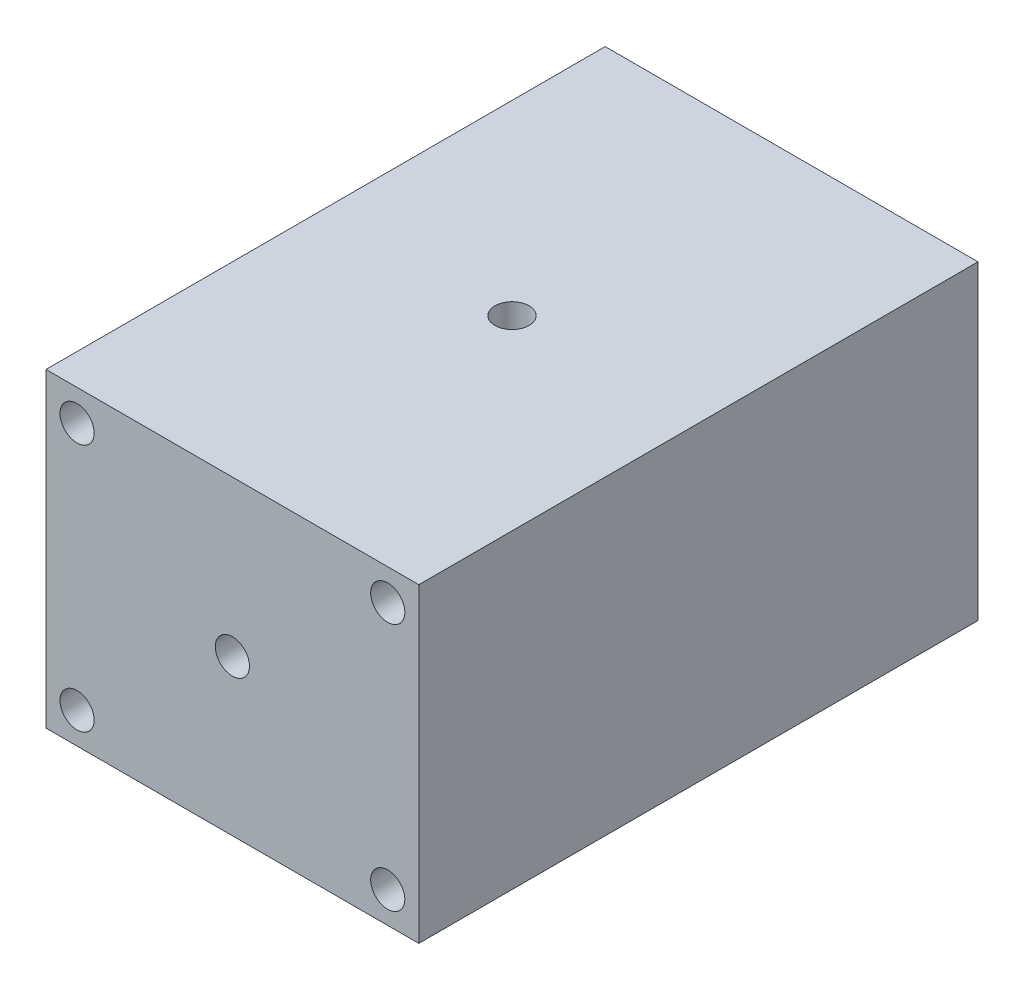
ISO-10303-21;
HEADER;
FILE_DESCRIPTION(('STEP AP214'),'2;1');
FILE_NAME('part.step','',(''),(''),'','','');
FILE_SCHEMA(('AUTOMOTIVE_DESIGN { 1 0 10303 214 1 1 1 1 }'));
ENDSEC;
DATA;
#1=APPLICATION_CONTEXT('core data for automotive mechanical design processes');
#2=APPLICATION_PROTOCOL_DEFINITION('international standard','automotive_design',2000,#1);
#3=PRODUCT_CONTEXT('',#1,'mechanical');
#4=PRODUCT('Part','Part','',(#3));
#5=PRODUCT_RELATED_PRODUCT_CATEGORY('part','',(#4));
#6=PRODUCT_DEFINITION_FORMATION('','',#4);
#7=PRODUCT_DEFINITION_CONTEXT('part definition',#1,'design');
#8=PRODUCT_DEFINITION('design','',#6,#7);
#9=PRODUCT_DEFINITION_SHAPE('','',#8);
#10=(LENGTH_UNIT() NAMED_UNIT(*) SI_UNIT(.MILLI.,.METRE.));
#11=(NAMED_UNIT(*) PLANE_ANGLE_UNIT() SI_UNIT($,.RADIAN.));
#12=(NAMED_UNIT(*) SI_UNIT($,.STERADIAN.) SOLID_ANGLE_UNIT());
#13=UNCERTAINTY_MEASURE_WITH_UNIT(LENGTH_MEASURE(1.E-05),#10,'distance_accuracy_value','');
#14=(GEOMETRIC_REPRESENTATION_CONTEXT(3) GLOBAL_UNCERTAINTY_ASSIGNED_CONTEXT((#13)) GLOBAL_UNIT_ASSIGNED_CONTEXT((#10,
#11,#12)) REPRESENTATION_CONTEXT('',''));
#15=CARTESIAN_POINT('',(0.,0.,0.));
#16=DIRECTION('',(0.,0.,1.));
#17=DIRECTION('',(1.,0.,0.));
#18=AXIS2_PLACEMENT_3D('',#15,#16,#17);
#19=CARTESIAN_POINT('',(0.,0.,90.));
#20=DIRECTION('',(0.,-1.,0.));
#21=DIRECTION('',(1.,0.,0.));
#22=AXIS2_PLACEMENT_3D('',#19,#20,#21);
#23=CYLINDRICAL_SURFACE('',#22,5.5);
#24=CARTESIAN_POINT('',(0.,0.,90.));
#25=DIRECTION('',(0.,-0.707106781186548,-0.707106781186548));
#26=DIRECTION('',(0.,0.707106781186548,-0.707106781186548));
#27=AXIS2_PLACEMENT_3D('',#24,#25,#26);
#28=ELLIPSE('',#27,7.778174593052,5.5);
#29=CARTESIAN_POINT('',(0.,5.5,84.5));
#30=VERTEX_POINT('',#29);
#31=CARTESIAN_POINT('',(5.5,0.,90.));
#32=VERTEX_POINT('',#31);
#33=EDGE_CURVE('E182',#30,#32,#28,.T.);
#34=ORIENTED_EDGE('',*,*,#33,.T.);
#35=DIRECTION('',(0.,1.,0.));
#36=VECTOR('',#35,1.);
#37=CARTESIAN_POINT('',(5.5,0.,90.));
#38=LINE('',#37,#36);
#39=CARTESIAN_POINT('',(5.5,50.,90.));
#40=VERTEX_POINT('',#39);
#41=EDGE_CURVE('E10',#32,#40,#38,.T.);
#42=ORIENTED_EDGE('',*,*,#41,.T.);
#43=CARTESIAN_POINT('',(0.,50.,90.));
#44=DIRECTION('',(0.,-1.,0.));
#45=DIRECTION('',(1.,0.,0.));
#46=AXIS2_PLACEMENT_3D('',#43,#44,#45);
#47=CIRCLE('',#46,5.5);
#48=EDGE_CURVE('E254',#40,#40,#47,.T.);
#49=ORIENTED_EDGE('',*,*,#48,.F.);
#50=ORIENTED_EDGE('',*,*,#41,.F.);
#51=CARTESIAN_POINT('',(0.,0.,90.));
#52=DIRECTION('',(0.,0.707106781186548,-0.707106781186548));
#53=DIRECTION('',(0.,-0.707106781186548,-0.707106781186548));
#54=AXIS2_PLACEMENT_3D('',#51,#52,#53);
#55=ELLIPSE('',#54,7.778174593052,5.5);
#56=CARTESIAN_POINT('',(-5.5,0.,90.));
#57=VERTEX_POINT('',#56);
#58=EDGE_CURVE('E271',#57,#32,#55,.T.);
#59=ORIENTED_EDGE('',*,*,#58,.F.);
#60=CARTESIAN_POINT('',(0.,0.,90.));
#61=DIRECTION('',(0.,-0.707106781186548,-0.707106781186548));
#62=DIRECTION('',(0.,0.707106781186548,-0.707106781186548));
#63=AXIS2_PLACEMENT_3D('',#60,#61,#62);
#64=ELLIPSE('',#63,7.778174593052,5.5);
#65=EDGE_CURVE('E37',#57,#30,#64,.T.);
#66=ORIENTED_EDGE('',*,*,#65,.T.);
#67=EDGE_LOOP('',(#34,#42,#49,#50,#59,#66));
#68=FACE_BOUND('',#67,.T.);
#69=ADVANCED_FACE('F16',(#68),#23,.F.);
#70=CARTESIAN_POINT('',(0.,0.,0.));
#71=DIRECTION('',(0.,0.,-1.));
#72=DIRECTION('',(1.,0.,0.));
#73=AXIS2_PLACEMENT_3D('',#70,#71,#72);
#74=CYLINDRICAL_SURFACE('',#73,5.5);
#75=CARTESIAN_POINT('',(0.,0.,90.));
#76=DIRECTION('',(0.,-0.707106781186548,-0.707106781186548));
#77=DIRECTION('',(0.,0.707106781186548,-0.707106781186548));
#78=AXIS2_PLACEMENT_3D('',#75,#76,#77);
#79=ELLIPSE('',#78,7.778174593052,5.5);
#80=EDGE_CURVE('E177',#32,#57,#79,.T.);
#81=ORIENTED_EDGE('',*,*,#80,.T.);
#82=ORIENTED_EDGE('',*,*,#58,.T.);
#83=DIRECTION('',(0.,0.,1.));
#84=VECTOR('',#83,1.);
#85=CARTESIAN_POINT('',(5.5,0.,0.));
#86=LINE('',#85,#84);
#87=CARTESIAN_POINT('',(5.5,0.,180.));
#88=VERTEX_POINT('',#87);
#89=EDGE_CURVE('E25',#32,#88,#86,.T.);
#90=ORIENTED_EDGE('',*,*,#89,.T.);
#91=CARTESIAN_POINT('',(0.,0.,180.));
#92=DIRECTION('',(0.,0.,-1.));
#93=DIRECTION('',(1.,0.,0.));
#94=AXIS2_PLACEMENT_3D('',#91,#92,#93);
#95=CIRCLE('',#94,5.5);
#96=EDGE_CURVE('E238',#88,#88,#95,.T.);
#97=ORIENTED_EDGE('',*,*,#96,.F.);
#98=ORIENTED_EDGE('',*,*,#89,.F.);
#99=EDGE_LOOP('',(#81,#82,#90,#97,#98));
#100=FACE_BOUND('',#99,.T.);
#101=ADVANCED_FACE('F18',(#100),#74,.F.);
#102=CARTESIAN_POINT('',(50.,40.,0.));
#103=DIRECTION('',(0.,0.,-1.));
#104=DIRECTION('',(1.,0.,0.));
#105=AXIS2_PLACEMENT_3D('',#102,#103,#104);
#106=CYLINDRICAL_SURFACE('',#105,5.5);
#107=CARTESIAN_POINT('',(50.,40.,0.));
#108=DIRECTION('',(0.,0.,1.));
#109=DIRECTION('',(1.,0.,0.));
#110=AXIS2_PLACEMENT_3D('',#107,#108,#109);
#111=CIRCLE('',#110,5.5);
#112=CARTESIAN_POINT('',(55.5,40.,0.));
#113=VERTEX_POINT('',#112);
#114=EDGE_CURVE('E209',#113,#113,#111,.T.);
#115=ORIENTED_EDGE('',*,*,#114,.F.);
#116=DIRECTION('',(0.,0.,1.));
#117=VECTOR('',#116,1.);
#118=CARTESIAN_POINT('',(55.5,40.,0.));
#119=LINE('',#118,#117);
#120=CARTESIAN_POINT('',(55.5,40.,180.));
#121=VERTEX_POINT('',#120);
#122=EDGE_CURVE('E190',#113,#121,#119,.T.);
#123=ORIENTED_EDGE('',*,*,#122,.T.);
#124=CARTESIAN_POINT('',(50.,40.,180.));
#125=DIRECTION('',(0.,0.,-1.));
#126=DIRECTION('',(1.,0.,0.));
#127=AXIS2_PLACEMENT_3D('',#124,#125,#126);
#128=CIRCLE('',#127,5.5);
#129=EDGE_CURVE('E173',#121,#121,#128,.T.);
#130=ORIENTED_EDGE('',*,*,#129,.F.);
#131=ORIENTED_EDGE('',*,*,#122,.F.);
#132=EDGE_LOOP('',(#115,#123,#130,#131));
#133=FACE_BOUND('',#132,.T.);
#134=ADVANCED_FACE('F317',(#133),#106,.F.);
#135=CARTESIAN_POINT('',(0.,0.,0.));
#136=DIRECTION('',(0.,0.,-1.));
#137=DIRECTION('',(1.,0.,0.));
#138=AXIS2_PLACEMENT_3D('',#135,#136,#137);
#139=CYLINDRICAL_SURFACE('',#138,5.5);
#140=CARTESIAN_POINT('',(0.,0.,0.));
#141=DIRECTION('',(0.,0.,1.));
#142=DIRECTION('',(1.,0.,0.));
#143=AXIS2_PLACEMENT_3D('',#140,#141,#142);
#144=CIRCLE('',#143,5.5);
#145=CARTESIAN_POINT('',(5.5,0.,0.));
#146=VERTEX_POINT('',#145);
#147=EDGE_CURVE('E210',#146,#146,#144,.T.);
#148=ORIENTED_EDGE('',*,*,#147,.F.);
#149=DIRECTION('',(0.,0.,1.));
#150=VECTOR('',#149,1.);
#151=CARTESIAN_POINT('',(5.5,0.,0.));
#152=LINE('',#151,#150);
#153=EDGE_CURVE('E185',#146,#32,#152,.T.);
#154=ORIENTED_EDGE('',*,*,#153,.T.);
#155=ORIENTED_EDGE('',*,*,#33,.F.);
#156=ORIENTED_EDGE('',*,*,#65,.F.);
#157=CARTESIAN_POINT('',(0.,0.,90.));
#158=DIRECTION('',(0.,0.707106781186548,-0.707106781186548));
#159=DIRECTION('',(0.,-0.707106781186548,-0.707106781186548));
#160=AXIS2_PLACEMENT_3D('',#157,#158,#159);
#161=ELLIPSE('',#160,7.778174593052,5.5);
#162=CARTESIAN_POINT('',(0.,-5.5,84.5));
#163=VERTEX_POINT('',#162);
#164=EDGE_CURVE('E175',#163,#57,#161,.T.);
#165=ORIENTED_EDGE('',*,*,#164,.F.);
#166=CARTESIAN_POINT('',(0.,0.,90.));
#167=DIRECTION('',(0.,0.707106781186548,-0.707106781186548));
#168=DIRECTION('',(0.,-0.707106781186548,-0.707106781186548));
#169=AXIS2_PLACEMENT_3D('',#166,#167,#168);
#170=ELLIPSE('',#169,7.778174593052,5.5);
#171=EDGE_CURVE('E178',#32,#163,#170,.T.);
#172=ORIENTED_EDGE('',*,*,#171,.F.);
#173=ORIENTED_EDGE('',*,*,#153,.F.);
#174=EDGE_LOOP('',(#148,#154,#155,#156,#165,#172,#173));
#175=FACE_BOUND('',#174,.T.);
#176=ADVANCED_FACE('F321',(#175),#139,.F.);
#177=CARTESIAN_POINT('',(-50.,40.,0.));
#178=DIRECTION('',(0.,0.,-1.));
#179=DIRECTION('',(1.,0.,0.));
#180=AXIS2_PLACEMENT_3D('',#177,#178,#179);
#181=CYLINDRICAL_SURFACE('',#180,5.5);
#182=CARTESIAN_POINT('',(-50.,40.,0.));
#183=DIRECTION('',(0.,0.,1.));
#184=DIRECTION('',(1.,0.,0.));
#185=AXIS2_PLACEMENT_3D('',#182,#183,#184);
#186=CIRCLE('',#185,5.5);
#187=CARTESIAN_POINT('',(-44.5,40.,0.));
#188=VERTEX_POINT('',#187);
#189=EDGE_CURVE('E214',#188,#188,#186,.T.);
#190=ORIENTED_EDGE('',*,*,#189,.F.);
#191=DIRECTION('',(0.,0.,1.));
#192=VECTOR('',#191,1.);
#193=CARTESIAN_POINT('',(-44.5,40.,0.));
#194=LINE('',#193,#192);
#195=CARTESIAN_POINT('',(-44.5,40.,180.));
#196=VERTEX_POINT('',#195);
#197=EDGE_CURVE('E263',#188,#196,#194,.T.);
#198=ORIENTED_EDGE('',*,*,#197,.T.);
#199=CARTESIAN_POINT('',(-50.,40.,180.));
#200=DIRECTION('',(0.,0.,-1.));
#201=DIRECTION('',(1.,0.,0.));
#202=AXIS2_PLACEMENT_3D('',#199,#200,#201);
#203=CIRCLE('',#202,5.5);
#204=EDGE_CURVE('E234',#196,#196,#203,.T.);
#205=ORIENTED_EDGE('',*,*,#204,.F.);
#206=ORIENTED_EDGE('',*,*,#197,.F.);
#207=EDGE_LOOP('',(#190,#198,#205,#206));
#208=FACE_BOUND('',#207,.T.);
#209=ADVANCED_FACE('F326',(#208),#181,.F.);
#210=CARTESIAN_POINT('',(50.,-40.,0.));
#211=DIRECTION('',(0.,0.,-1.));
#212=DIRECTION('',(1.,0.,0.));
#213=AXIS2_PLACEMENT_3D('',#210,#211,#212);
#214=CYLINDRICAL_SURFACE('',#213,5.5);
#215=CARTESIAN_POINT('',(50.,-40.,0.));
#216=DIRECTION('',(0.,0.,1.));
#217=DIRECTION('',(1.,0.,0.));
#218=AXIS2_PLACEMENT_3D('',#215,#216,#217);
#219=CIRCLE('',#218,5.5);
#220=CARTESIAN_POINT('',(55.5,-40.,0.));
#221=VERTEX_POINT('',#220);
#222=EDGE_CURVE('E196',#221,#221,#219,.T.);
#223=ORIENTED_EDGE('',*,*,#222,.F.);
#224=DIRECTION('',(0.,0.,1.));
#225=VECTOR('',#224,1.);
#226=CARTESIAN_POINT('',(55.5,-40.,0.));
#227=LINE('',#226,#225);
#228=CARTESIAN_POINT('',(55.5,-40.,180.));
#229=VERTEX_POINT('',#228);
#230=EDGE_CURVE('E260',#221,#229,#227,.T.);
#231=ORIENTED_EDGE('',*,*,#230,.T.);
#232=CARTESIAN_POINT('',(50.,-40.,180.));
#233=DIRECTION('',(0.,0.,-1.));
#234=DIRECTION('',(1.,0.,0.));
#235=AXIS2_PLACEMENT_3D('',#232,#233,#234);
#236=CIRCLE('',#235,5.5);
#237=EDGE_CURVE('E230',#229,#229,#236,.T.);
#238=ORIENTED_EDGE('',*,*,#237,.F.);
#239=ORIENTED_EDGE('',*,*,#230,.F.);
#240=EDGE_LOOP('',(#223,#231,#238,#239));
#241=FACE_BOUND('',#240,.T.);
#242=ADVANCED_FACE('F308',(#241),#214,.F.);
#243=CARTESIAN_POINT('',(-50.,-40.,0.));
#244=DIRECTION('',(0.,0.,-1.));
#245=DIRECTION('',(1.,0.,0.));
#246=AXIS2_PLACEMENT_3D('',#243,#244,#245);
#247=CYLINDRICAL_SURFACE('',#246,5.5);
#248=CARTESIAN_POINT('',(-50.,-40.,0.));
#249=DIRECTION('',(0.,0.,1.));
#250=DIRECTION('',(1.,0.,0.));
#251=AXIS2_PLACEMENT_3D('',#248,#249,#250);
#252=CIRCLE('',#251,5.5);
#253=CARTESIAN_POINT('',(-44.5,-40.,0.));
#254=VERTEX_POINT('',#253);
#255=EDGE_CURVE('E192',#254,#254,#252,.T.);
#256=ORIENTED_EDGE('',*,*,#255,.F.);
#257=DIRECTION('',(0.,0.,1.));
#258=VECTOR('',#257,1.);
#259=CARTESIAN_POINT('',(-44.5,-40.,0.));
#260=LINE('',#259,#258);
#261=CARTESIAN_POINT('',(-44.5,-40.,180.));
#262=VERTEX_POINT('',#261);
#263=EDGE_CURVE('E257',#254,#262,#260,.T.);
#264=ORIENTED_EDGE('',*,*,#263,.T.);
#265=CARTESIAN_POINT('',(-50.,-40.,180.));
#266=DIRECTION('',(0.,0.,-1.));
#267=DIRECTION('',(1.,0.,0.));
#268=AXIS2_PLACEMENT_3D('',#265,#266,#267);
#269=CIRCLE('',#268,5.5);
#270=EDGE_CURVE('E226',#262,#262,#269,.T.);
#271=ORIENTED_EDGE('',*,*,#270,.F.);
#272=ORIENTED_EDGE('',*,*,#263,.F.);
#273=EDGE_LOOP('',(#256,#264,#271,#272));
#274=FACE_BOUND('',#273,.T.);
#275=ADVANCED_FACE('F298',(#274),#247,.F.);
#276=CARTESIAN_POINT('',(60.,50.,0.));
#277=DIRECTION('',(0.,-1.,0.));
#278=DIRECTION('',(0.,0.,-1.));
#279=AXIS2_PLACEMENT_3D('',#276,#277,#278);
#280=PLANE('',#279);
#281=ORIENTED_EDGE('',*,*,#48,.T.);
#282=EDGE_LOOP('',(#281));
#283=FACE_BOUND('',#282,.T.);
#284=DIRECTION('',(-1.,0.,0.));
#285=VECTOR('',#284,1.);
#286=CARTESIAN_POINT('',(60.,50.,0.));
#287=LINE('',#286,#285);
#288=CARTESIAN_POINT('',(60.,50.,0.));
#289=VERTEX_POINT('',#288);
#290=CARTESIAN_POINT('',(-60.,50.,0.));
#291=VERTEX_POINT('',#290);
#292=EDGE_CURVE('E197',#289,#291,#287,.T.);
#293=ORIENTED_EDGE('',*,*,#292,.T.);
#294=DIRECTION('',(0.,0.,1.));
#295=VECTOR('',#294,1.);
#296=CARTESIAN_POINT('',(-60.,50.,0.));
#297=LINE('',#296,#295);
#298=CARTESIAN_POINT('',(-60.,50.,180.));
#299=VERTEX_POINT('',#298);
#300=EDGE_CURVE('E142',#291,#299,#297,.T.);
#301=ORIENTED_EDGE('',*,*,#300,.T.);
#302=DIRECTION('',(-1.,0.,0.));
#303=VECTOR('',#302,1.);
#304=CARTESIAN_POINT('',(60.,50.,180.));
#305=LINE('',#304,#303);
#306=CARTESIAN_POINT('',(60.,50.,180.));
#307=VERTEX_POINT('',#306);
#308=EDGE_CURVE('E208',#307,#299,#305,.T.);
#309=ORIENTED_EDGE('',*,*,#308,.F.);
#310=DIRECTION('',(0.,0.,1.));
#311=VECTOR('',#310,1.);
#312=CARTESIAN_POINT('',(60.,50.,0.));
#313=LINE('',#312,#311);
#314=EDGE_CURVE('E242',#289,#307,#313,.T.);
#315=ORIENTED_EDGE('',*,*,#314,.F.);
#316=EDGE_LOOP('',(#293,#301,#309,#315));
#317=FACE_BOUND('',#316,.T.);
#318=ADVANCED_FACE('F295',(#283,#317),#280,.F.);
#319=CARTESIAN_POINT('',(0.,0.,90.));
#320=DIRECTION('',(0.,1.,0.));
#321=DIRECTION('',(1.,0.,0.));
#322=AXIS2_PLACEMENT_3D('',#319,#320,#321);
#323=CYLINDRICAL_SURFACE('',#322,5.5);
#324=DIRECTION('',(0.,-1.,0.));
#325=VECTOR('',#324,1.);
#326=CARTESIAN_POINT('',(5.5,0.,90.));
#327=LINE('',#326,#325);
#328=CARTESIAN_POINT('',(5.5,-50.,90.));
#329=VERTEX_POINT('',#328);
#330=EDGE_CURVE('E245',#32,#329,#327,.T.);
#331=ORIENTED_EDGE('',*,*,#330,.F.);
#332=ORIENTED_EDGE('',*,*,#171,.T.);
#333=ORIENTED_EDGE('',*,*,#164,.T.);
#334=ORIENTED_EDGE('',*,*,#80,.F.);
#335=ORIENTED_EDGE('',*,*,#330,.T.);
#336=CARTESIAN_POINT('',(0.,-50.,90.));
#337=DIRECTION('',(0.,1.,0.));
#338=DIRECTION('',(1.,0.,0.));
#339=AXIS2_PLACEMENT_3D('',#336,#337,#338);
#340=CIRCLE('',#339,5.5);
#341=EDGE_CURVE('E148',#329,#329,#340,.T.);
#342=ORIENTED_EDGE('',*,*,#341,.F.);
#343=EDGE_LOOP('',(#331,#332,#333,#334,#335,#342));
#344=FACE_BOUND('',#343,.T.);
#345=ADVANCED_FACE('F297',(#344),#323,.F.);
#346=CARTESIAN_POINT('',(60.,-50.,0.));
#347=DIRECTION('',(-1.,0.,0.));
#348=DIRECTION('',(0.,0.,1.));
#349=AXIS2_PLACEMENT_3D('',#346,#347,#348);
#350=PLANE('',#349);
#351=DIRECTION('',(0.,1.,0.));
#352=VECTOR('',#351,1.);
#353=CARTESIAN_POINT('',(60.,-50.,0.));
#354=LINE('',#353,#352);
#355=CARTESIAN_POINT('',(60.,-50.,0.));
#356=VERTEX_POINT('',#355);
#357=EDGE_CURVE('E161',#356,#289,#354,.T.);
#358=ORIENTED_EDGE('',*,*,#357,.T.);
#359=ORIENTED_EDGE('',*,*,#314,.T.);
#360=DIRECTION('',(0.,1.,0.));
#361=VECTOR('',#360,1.);
#362=CARTESIAN_POINT('',(60.,-50.,180.));
#363=LINE('',#362,#361);
#364=CARTESIAN_POINT('',(60.,-50.,180.));
#365=VERTEX_POINT('',#364);
#366=EDGE_CURVE('E204',#365,#307,#363,.T.);
#367=ORIENTED_EDGE('',*,*,#366,.F.);
#368=DIRECTION('',(0.,0.,1.));
#369=VECTOR('',#368,1.);
#370=CARTESIAN_POINT('',(60.,-50.,0.));
#371=LINE('',#370,#369);
#372=EDGE_CURVE('E164',#356,#365,#371,.T.);
#373=ORIENTED_EDGE('',*,*,#372,.F.);
#374=EDGE_LOOP('',(#358,#359,#367,#373));
#375=FACE_BOUND('',#374,.T.);
#376=ADVANCED_FACE('F283',(#375),#350,.F.);
#377=CARTESIAN_POINT('',(0.,0.,180.));
#378=DIRECTION('',(0.,0.,1.));
#379=DIRECTION('',(1.,0.,0.));
#380=AXIS2_PLACEMENT_3D('',#377,#378,#379);
#381=PLANE('',#380);
#382=ORIENTED_EDGE('',*,*,#129,.T.);
#383=EDGE_LOOP('',(#382));
#384=FACE_BOUND('',#383,.T.);
#385=ORIENTED_EDGE('',*,*,#96,.T.);
#386=EDGE_LOOP('',(#385));
#387=FACE_BOUND('',#386,.T.);
#388=ORIENTED_EDGE('',*,*,#204,.T.);
#389=EDGE_LOOP('',(#388));
#390=FACE_BOUND('',#389,.T.);
#391=ORIENTED_EDGE('',*,*,#237,.T.);
#392=EDGE_LOOP('',(#391));
#393=FACE_BOUND('',#392,.T.);
#394=ORIENTED_EDGE('',*,*,#270,.T.);
#395=EDGE_LOOP('',(#394));
#396=FACE_BOUND('',#395,.T.);
#397=DIRECTION('',(1.,0.,0.));
#398=VECTOR('',#397,1.);
#399=CARTESIAN_POINT('',(-60.,-50.,180.));
#400=LINE('',#399,#398);
#401=CARTESIAN_POINT('',(-60.,-50.,180.));
#402=VERTEX_POINT('',#401);
#403=EDGE_CURVE('E156',#402,#365,#400,.T.);
#404=ORIENTED_EDGE('',*,*,#403,.T.);
#405=ORIENTED_EDGE('',*,*,#366,.T.);
#406=ORIENTED_EDGE('',*,*,#308,.T.);
#407=DIRECTION('',(0.,-1.,0.));
#408=VECTOR('',#407,1.);
#409=CARTESIAN_POINT('',(-60.,50.,180.));
#410=LINE('',#409,#408);
#411=EDGE_CURVE('E147',#299,#402,#410,.T.);
#412=ORIENTED_EDGE('',*,*,#411,.T.);
#413=EDGE_LOOP('',(#404,#405,#406,#412));
#414=FACE_BOUND('',#413,.T.);
#415=ADVANCED_FACE('F280',(#384,#387,#390,#393,#396,#414),#381,.T.);
#416=CARTESIAN_POINT('',(0.,0.,0.));
#417=DIRECTION('',(0.,0.,1.));
#418=DIRECTION('',(1.,0.,0.));
#419=AXIS2_PLACEMENT_3D('',#416,#417,#418);
#420=PLANE('',#419);
#421=ORIENTED_EDGE('',*,*,#114,.T.);
#422=EDGE_LOOP('',(#421));
#423=FACE_BOUND('',#422,.T.);
#424=ORIENTED_EDGE('',*,*,#147,.T.);
#425=EDGE_LOOP('',(#424));
#426=FACE_BOUND('',#425,.T.);
#427=ORIENTED_EDGE('',*,*,#189,.T.);
#428=EDGE_LOOP('',(#427));
#429=FACE_BOUND('',#428,.T.);
#430=ORIENTED_EDGE('',*,*,#222,.T.);
#431=EDGE_LOOP('',(#430));
#432=FACE_BOUND('',#431,.T.);
#433=ORIENTED_EDGE('',*,*,#255,.T.);
#434=EDGE_LOOP('',(#433));
#435=FACE_BOUND('',#434,.T.);
#436=DIRECTION('',(0.,-1.,0.));
#437=VECTOR('',#436,1.);
#438=CARTESIAN_POINT('',(-60.,50.,0.));
#439=LINE('',#438,#437);
#440=CARTESIAN_POINT('',(-60.,-50.,0.));
#441=VERTEX_POINT('',#440);
#442=EDGE_CURVE('E135',#291,#441,#439,.T.);
#443=ORIENTED_EDGE('',*,*,#442,.F.);
#444=ORIENTED_EDGE('',*,*,#292,.F.);
#445=ORIENTED_EDGE('',*,*,#357,.F.);
#446=DIRECTION('',(1.,0.,0.));
#447=VECTOR('',#446,1.);
#448=CARTESIAN_POINT('',(-60.,-50.,0.));
#449=LINE('',#448,#447);
#450=EDGE_CURVE('E154',#441,#356,#449,.T.);
#451=ORIENTED_EDGE('',*,*,#450,.F.);
#452=EDGE_LOOP('',(#443,#444,#445,#451));
#453=FACE_BOUND('',#452,.T.);
#454=ADVANCED_FACE('F159',(#423,#426,#429,#432,#435,#453),#420,.F.);
#455=CARTESIAN_POINT('',(-60.,50.,0.));
#456=DIRECTION('',(1.,0.,0.));
#457=DIRECTION('',(0.,1.,0.));
#458=AXIS2_PLACEMENT_3D('',#455,#456,#457);
#459=PLANE('',#458);
#460=ORIENTED_EDGE('',*,*,#442,.T.);
#461=DIRECTION('',(0.,0.,1.));
#462=VECTOR('',#461,1.);
#463=CARTESIAN_POINT('',(-60.,-50.,0.));
#464=LINE('',#463,#462);
#465=EDGE_CURVE('E139',#441,#402,#464,.T.);
#466=ORIENTED_EDGE('',*,*,#465,.T.);
#467=ORIENTED_EDGE('',*,*,#411,.F.);
#468=ORIENTED_EDGE('',*,*,#300,.F.);
#469=EDGE_LOOP('',(#460,#466,#467,#468));
#470=FACE_BOUND('',#469,.T.);
#471=ADVANCED_FACE('F137',(#470),#459,.F.);
#472=CARTESIAN_POINT('',(-60.,-50.,0.));
#473=DIRECTION('',(0.,1.,0.));
#474=DIRECTION('',(1.,0.,0.));
#475=AXIS2_PLACEMENT_3D('',#472,#473,#474);
#476=PLANE('',#475);
#477=ORIENTED_EDGE('',*,*,#341,.T.);
#478=EDGE_LOOP('',(#477));
#479=FACE_BOUND('',#478,.T.);
#480=ORIENTED_EDGE('',*,*,#450,.T.);
#481=ORIENTED_EDGE('',*,*,#372,.T.);
#482=ORIENTED_EDGE('',*,*,#403,.F.);
#483=ORIENTED_EDGE('',*,*,#465,.F.);
#484=EDGE_LOOP('',(#480,#481,#482,#483));
#485=FACE_BOUND('',#484,.T.);
#486=ADVANCED_FACE('F152',(#479,#485),#476,.F.);
#487=CLOSED_SHELL('',(#69,#101,#134,#176,#209,#242,#275,#318,#345,#376,#415,#454,#471,#486));
#488=MANIFOLD_SOLID_BREP('B1',#487);
#489=ADVANCED_BREP_SHAPE_REPRESENTATION('',(#18,#488),#14);
#490=SHAPE_DEFINITION_REPRESENTATION(#9,#489);
ENDSEC;
END-ISO-10303-21;
